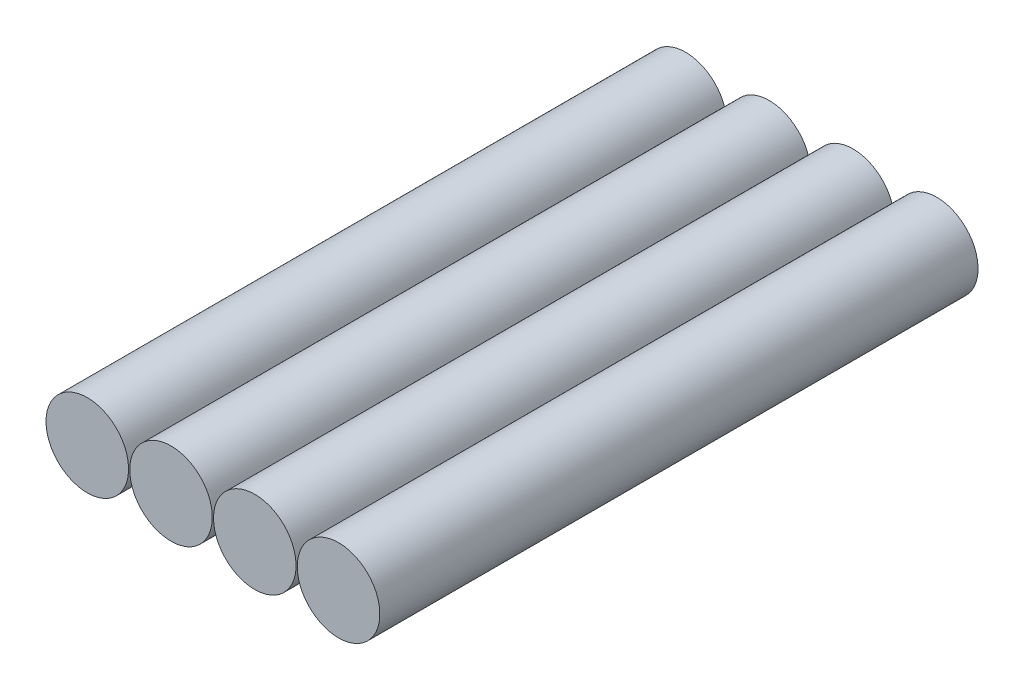
ISO-10303-21;
HEADER;
FILE_DESCRIPTION(('STEP AP214'),'2;1');
FILE_NAME('part.step','',(''),(''),'','','');
FILE_SCHEMA(('AUTOMOTIVE_DESIGN { 1 0 10303 214 1 1 1 1 }'));
ENDSEC;
DATA;
#1=APPLICATION_CONTEXT('core data for automotive mechanical design processes');
#2=APPLICATION_PROTOCOL_DEFINITION('international standard','automotive_design',2000,#1);
#3=PRODUCT_CONTEXT('',#1,'mechanical');
#4=PRODUCT('Part','Part','',(#3));
#5=PRODUCT_RELATED_PRODUCT_CATEGORY('part','',(#4));
#6=PRODUCT_DEFINITION_FORMATION('','',#4);
#7=PRODUCT_DEFINITION_CONTEXT('part definition',#1,'design');
#8=PRODUCT_DEFINITION('design','',#6,#7);
#9=PRODUCT_DEFINITION_SHAPE('','',#8);
#10=(LENGTH_UNIT() NAMED_UNIT(*) SI_UNIT(.MILLI.,.METRE.));
#11=(NAMED_UNIT(*) PLANE_ANGLE_UNIT() SI_UNIT($,.RADIAN.));
#12=(NAMED_UNIT(*) SI_UNIT($,.STERADIAN.) SOLID_ANGLE_UNIT());
#13=UNCERTAINTY_MEASURE_WITH_UNIT(LENGTH_MEASURE(1.E-05),#10,'distance_accuracy_value','');
#14=(GEOMETRIC_REPRESENTATION_CONTEXT(3) GLOBAL_UNCERTAINTY_ASSIGNED_CONTEXT((#13)) GLOBAL_UNIT_ASSIGNED_CONTEXT((#10,
#11,#12)) REPRESENTATION_CONTEXT('',''));
#15=CARTESIAN_POINT('',(0.,0.,0.));
#16=DIRECTION('',(0.,0.,1.));
#17=DIRECTION('',(1.,0.,0.));
#18=AXIS2_PLACEMENT_3D('',#15,#16,#17);
#19=CARTESIAN_POINT('',(20.29,1.65924554587383,-47.));
#20=DIRECTION('',(0.,0.,-1.));
#21=DIRECTION('',(0.,-1.,0.));
#22=AXIS2_PLACEMENT_3D('',#19,#20,#21);
#23=PLANE('',#22);
#24=CARTESIAN_POINT('',(20.29,1.65924554587383,-47.));
#25=DIRECTION('',(0.,0.,-1.));
#26=DIRECTION('',(1.,0.,0.));
#27=AXIS2_PLACEMENT_3D('',#24,#25,#26);
#28=CIRCLE('',#27,0.69);
#29=CARTESIAN_POINT('',(19.6,1.65924554587383,-47.));
#30=VERTEX_POINT('',#29);
#31=EDGE_CURVE('P0_E20',#30,#30,#28,.T.);
#32=ORIENTED_EDGE('',*,*,#31,.T.);
#33=EDGE_LOOP('',(#32));
#34=FACE_BOUND('',#33,.T.);
#35=ADVANCED_FACE('P0_F17',(#34),#23,.T.);
#36=CARTESIAN_POINT('',(20.29,1.65924554587383,-42.));
#37=DIRECTION('',(0.,0.,-1.));
#38=DIRECTION('',(1.,0.,0.));
#39=AXIS2_PLACEMENT_3D('',#36,#37,#38);
#40=CYLINDRICAL_SURFACE('',#39,0.69);
#41=ORIENTED_EDGE('',*,*,#31,.F.);
#42=DIRECTION('',(0.,0.,1.));
#43=VECTOR('',#42,1.);
#44=CARTESIAN_POINT('',(19.6,1.65924554587383,-42.));
#45=LINE('',#44,#43);
#46=CARTESIAN_POINT('',(19.6,1.65924554587383,-37.));
#47=VERTEX_POINT('',#46);
#48=EDGE_CURVE('P0_E11',#30,#47,#45,.T.);
#49=ORIENTED_EDGE('',*,*,#48,.T.);
#50=CARTESIAN_POINT('',(20.29,1.65924554587383,-37.));
#51=DIRECTION('',(0.,0.,1.));
#52=DIRECTION('',(1.,0.,0.));
#53=AXIS2_PLACEMENT_3D('',#50,#51,#52);
#54=CIRCLE('',#53,0.69);
#55=EDGE_CURVE('P0_E41',#47,#47,#54,.T.);
#56=ORIENTED_EDGE('',*,*,#55,.F.);
#57=ORIENTED_EDGE('',*,*,#48,.F.);
#58=EDGE_LOOP('',(#41,#49,#56,#57));
#59=FACE_BOUND('',#58,.T.);
#60=ADVANCED_FACE('P0_F40',(#59),#40,.T.);
#61=CARTESIAN_POINT('',(20.29,1.65924554587383,-37.));
#62=DIRECTION('',(0.,0.,-1.));
#63=DIRECTION('',(0.,-1.,0.));
#64=AXIS2_PLACEMENT_3D('',#61,#62,#63);
#65=PLANE('',#64);
#66=ORIENTED_EDGE('',*,*,#55,.T.);
#67=EDGE_LOOP('',(#66));
#68=FACE_BOUND('',#67,.T.);
#69=ADVANCED_FACE('P0_F43',(#68),#65,.F.);
#70=CLOSED_SHELL('',(#35,#60,#69));
#71=MANIFOLD_SOLID_BREP('P0_B1',#70);
#72=CARTESIAN_POINT('',(21.69,1.65924554587383,-47.));
#73=DIRECTION('',(0.,0.,-1.));
#74=DIRECTION('',(0.,-1.,0.));
#75=AXIS2_PLACEMENT_3D('',#72,#73,#74);
#76=PLANE('',#75);
#77=CARTESIAN_POINT('',(21.69,1.65924554587383,-47.));
#78=DIRECTION('',(0.,0.,-1.));
#79=DIRECTION('',(1.,0.,0.));
#80=AXIS2_PLACEMENT_3D('',#77,#78,#79);
#81=CIRCLE('',#80,0.69);
#82=CARTESIAN_POINT('',(21.,1.65924554587383,-47.));
#83=VERTEX_POINT('',#82);
#84=EDGE_CURVE('P1_E21',#83,#83,#81,.T.);
#85=ORIENTED_EDGE('',*,*,#84,.T.);
#86=EDGE_LOOP('',(#85));
#87=FACE_BOUND('',#86,.T.);
#88=ADVANCED_FACE('P1_F17',(#87),#76,.T.);
#89=CARTESIAN_POINT('',(21.69,1.65924554587383,-42.));
#90=DIRECTION('',(0.,0.,-1.));
#91=DIRECTION('',(1.,0.,0.));
#92=AXIS2_PLACEMENT_3D('',#89,#90,#91);
#93=CYLINDRICAL_SURFACE('',#92,0.69);
#94=ORIENTED_EDGE('',*,*,#84,.F.);
#95=DIRECTION('',(0.,0.,1.));
#96=VECTOR('',#95,1.);
#97=CARTESIAN_POINT('',(21.,1.65924554587383,-42.));
#98=LINE('',#97,#96);
#99=CARTESIAN_POINT('',(21.,1.65924554587383,-37.));
#100=VERTEX_POINT('',#99);
#101=EDGE_CURVE('P1_E11',#83,#100,#98,.T.);
#102=ORIENTED_EDGE('',*,*,#101,.T.);
#103=CARTESIAN_POINT('',(21.69,1.65924554587383,-37.));
#104=DIRECTION('',(0.,0.,1.));
#105=DIRECTION('',(1.,0.,0.));
#106=AXIS2_PLACEMENT_3D('',#103,#104,#105);
#107=CIRCLE('',#106,0.69);
#108=EDGE_CURVE('P1_E42',#100,#100,#107,.T.);
#109=ORIENTED_EDGE('',*,*,#108,.F.);
#110=ORIENTED_EDGE('',*,*,#101,.F.);
#111=EDGE_LOOP('',(#94,#102,#109,#110));
#112=FACE_BOUND('',#111,.T.);
#113=ADVANCED_FACE('P1_F19',(#112),#93,.T.);
#114=CARTESIAN_POINT('',(21.69,1.65924554587383,-37.));
#115=DIRECTION('',(0.,0.,-1.));
#116=DIRECTION('',(0.,-1.,0.));
#117=AXIS2_PLACEMENT_3D('',#114,#115,#116);
#118=PLANE('',#117);
#119=ORIENTED_EDGE('',*,*,#108,.T.);
#120=EDGE_LOOP('',(#119));
#121=FACE_BOUND('',#120,.T.);
#122=ADVANCED_FACE('P1_F44',(#121),#118,.F.);
#123=CLOSED_SHELL('',(#88,#113,#122));
#124=MANIFOLD_SOLID_BREP('P1_B1',#123);
#125=CARTESIAN_POINT('',(23.09,1.65924554587383,-47.));
#126=DIRECTION('',(0.,0.,-1.));
#127=DIRECTION('',(0.,-1.,0.));
#128=AXIS2_PLACEMENT_3D('',#125,#126,#127);
#129=PLANE('',#128);
#130=CARTESIAN_POINT('',(23.09,1.65924554587383,-47.));
#131=DIRECTION('',(0.,0.,-1.));
#132=DIRECTION('',(1.,0.,0.));
#133=AXIS2_PLACEMENT_3D('',#130,#131,#132);
#134=CIRCLE('',#133,0.69);
#135=CARTESIAN_POINT('',(22.4,1.65924554587383,-47.));
#136=VERTEX_POINT('',#135);
#137=EDGE_CURVE('P2_E26',#136,#136,#134,.T.);
#138=ORIENTED_EDGE('',*,*,#137,.T.);
#139=EDGE_LOOP('',(#138));
#140=FACE_BOUND('',#139,.T.);
#141=ADVANCED_FACE('P2_F17',(#140),#129,.T.);
#142=CARTESIAN_POINT('',(23.09,1.65924554587383,-42.));
#143=DIRECTION('',(0.,0.,-1.));
#144=DIRECTION('',(1.,0.,0.));
#145=AXIS2_PLACEMENT_3D('',#142,#143,#144);
#146=CYLINDRICAL_SURFACE('',#145,0.69);
#147=ORIENTED_EDGE('',*,*,#137,.F.);
#148=DIRECTION('',(0.,0.,1.));
#149=VECTOR('',#148,1.);
#150=CARTESIAN_POINT('',(22.4,1.65924554587383,-42.));
#151=LINE('',#150,#149);
#152=CARTESIAN_POINT('',(22.4,1.65924554587383,-37.));
#153=VERTEX_POINT('',#152);
#154=EDGE_CURVE('P2_E11',#136,#153,#151,.T.);
#155=ORIENTED_EDGE('',*,*,#154,.T.);
#156=CARTESIAN_POINT('',(23.09,1.65924554587383,-37.));
#157=DIRECTION('',(0.,0.,1.));
#158=DIRECTION('',(1.,0.,0.));
#159=AXIS2_PLACEMENT_3D('',#156,#157,#158);
#160=CIRCLE('',#159,0.69);
#161=EDGE_CURVE('P2_E42',#153,#153,#160,.T.);
#162=ORIENTED_EDGE('',*,*,#161,.F.);
#163=ORIENTED_EDGE('',*,*,#154,.F.);
#164=EDGE_LOOP('',(#147,#155,#162,#163));
#165=FACE_BOUND('',#164,.T.);
#166=ADVANCED_FACE('P2_F41',(#165),#146,.T.);
#167=CARTESIAN_POINT('',(23.09,1.65924554587383,-37.));
#168=DIRECTION('',(0.,0.,-1.));
#169=DIRECTION('',(0.,-1.,0.));
#170=AXIS2_PLACEMENT_3D('',#167,#168,#169);
#171=PLANE('',#170);
#172=ORIENTED_EDGE('',*,*,#161,.T.);
#173=EDGE_LOOP('',(#172));
#174=FACE_BOUND('',#173,.T.);
#175=ADVANCED_FACE('P2_F19',(#174),#171,.F.);
#176=CLOSED_SHELL('',(#141,#166,#175));
#177=MANIFOLD_SOLID_BREP('P2_B1',#176);
#178=CARTESIAN_POINT('',(18.89,1.65924554587383,-47.));
#179=DIRECTION('',(0.,0.,-1.));
#180=DIRECTION('',(0.,-1.,0.));
#181=AXIS2_PLACEMENT_3D('',#178,#179,#180);
#182=PLANE('',#181);
#183=CARTESIAN_POINT('',(18.89,1.65924554587383,-47.));
#184=DIRECTION('',(0.,0.,-1.));
#185=DIRECTION('',(1.,0.,0.));
#186=AXIS2_PLACEMENT_3D('',#183,#184,#185);
#187=CIRCLE('',#186,0.69);
#188=CARTESIAN_POINT('',(18.2,1.65924554587383,-47.));
#189=VERTEX_POINT('',#188);
#190=EDGE_CURVE('P3_E26',#189,#189,#187,.T.);
#191=ORIENTED_EDGE('',*,*,#190,.T.);
#192=EDGE_LOOP('',(#191));
#193=FACE_BOUND('',#192,.T.);
#194=ADVANCED_FACE('P3_F17',(#193),#182,.T.);
#195=CARTESIAN_POINT('',(18.89,1.65924554587383,-42.));
#196=DIRECTION('',(0.,0.,-1.));
#197=DIRECTION('',(1.,0.,0.));
#198=AXIS2_PLACEMENT_3D('',#195,#196,#197);
#199=CYLINDRICAL_SURFACE('',#198,0.69);
#200=ORIENTED_EDGE('',*,*,#190,.F.);
#201=DIRECTION('',(0.,0.,1.));
#202=VECTOR('',#201,1.);
#203=CARTESIAN_POINT('',(18.2,1.65924554587383,-42.));
#204=LINE('',#203,#202);
#205=CARTESIAN_POINT('',(18.2,1.65924554587383,-37.));
#206=VERTEX_POINT('',#205);
#207=EDGE_CURVE('P3_E11',#189,#206,#204,.T.);
#208=ORIENTED_EDGE('',*,*,#207,.T.);
#209=CARTESIAN_POINT('',(18.89,1.65924554587383,-37.));
#210=DIRECTION('',(0.,0.,1.));
#211=DIRECTION('',(1.,0.,0.));
#212=AXIS2_PLACEMENT_3D('',#209,#210,#211);
#213=CIRCLE('',#212,0.69);
#214=EDGE_CURVE('P3_E41',#206,#206,#213,.T.);
#215=ORIENTED_EDGE('',*,*,#214,.F.);
#216=ORIENTED_EDGE('',*,*,#207,.F.);
#217=EDGE_LOOP('',(#200,#208,#215,#216));
#218=FACE_BOUND('',#217,.T.);
#219=ADVANCED_FACE('P3_F19',(#218),#199,.T.);
#220=CARTESIAN_POINT('',(18.89,1.65924554587383,-37.));
#221=DIRECTION('',(0.,0.,-1.));
#222=DIRECTION('',(0.,-1.,0.));
#223=AXIS2_PLACEMENT_3D('',#220,#221,#222);
#224=PLANE('',#223);
#225=ORIENTED_EDGE('',*,*,#214,.T.);
#226=EDGE_LOOP('',(#225));
#227=FACE_BOUND('',#226,.T.);
#228=ADVANCED_FACE('P3_F43',(#227),#224,.F.);
#229=CLOSED_SHELL('',(#194,#219,#228));
#230=MANIFOLD_SOLID_BREP('P3_B1',#229);
#231=ADVANCED_BREP_SHAPE_REPRESENTATION('',(#18,#71,#124,#177,#230),#14);
#232=SHAPE_DEFINITION_REPRESENTATION(#9,#231);
ENDSEC;
END-ISO-10303-21;
